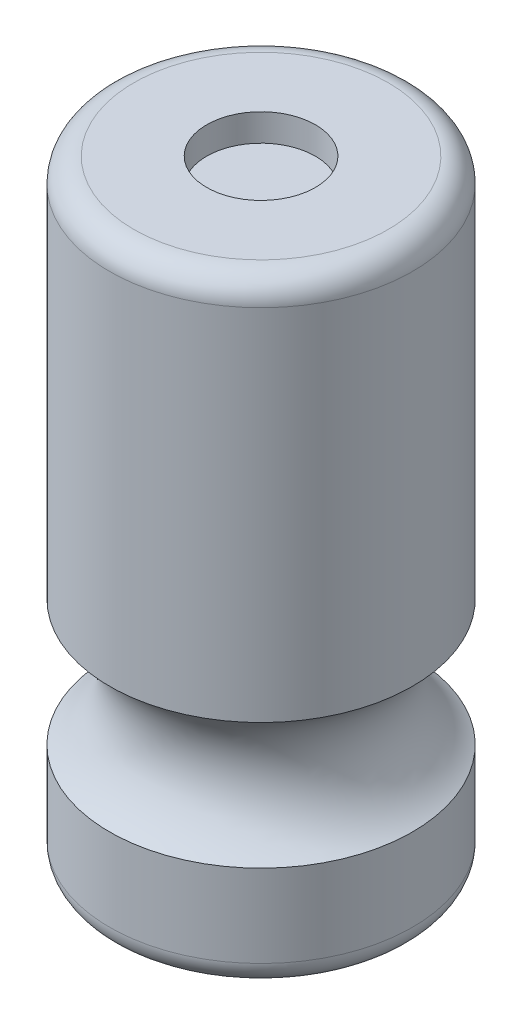
ISO-10303-21;
HEADER;
FILE_DESCRIPTION(('STEP AP214'),'2;1');
FILE_NAME('part.step','',(''),(''),'','','');
FILE_SCHEMA(('AUTOMOTIVE_DESIGN { 1 0 10303 214 1 1 1 1 }'));
ENDSEC;
DATA;
#1=APPLICATION_CONTEXT('core data for automotive mechanical design processes');
#2=APPLICATION_PROTOCOL_DEFINITION('international standard','automotive_design',2000,#1);
#3=PRODUCT_CONTEXT('',#1,'mechanical');
#4=PRODUCT('Part','Part','',(#3));
#5=PRODUCT_RELATED_PRODUCT_CATEGORY('part','',(#4));
#6=PRODUCT_DEFINITION_FORMATION('','',#4);
#7=PRODUCT_DEFINITION_CONTEXT('part definition',#1,'design');
#8=PRODUCT_DEFINITION('design','',#6,#7);
#9=PRODUCT_DEFINITION_SHAPE('','',#8);
#10=(LENGTH_UNIT() NAMED_UNIT(*) SI_UNIT(.MILLI.,.METRE.));
#11=(NAMED_UNIT(*) PLANE_ANGLE_UNIT() SI_UNIT($,.RADIAN.));
#12=(NAMED_UNIT(*) SI_UNIT($,.STERADIAN.) SOLID_ANGLE_UNIT());
#13=UNCERTAINTY_MEASURE_WITH_UNIT(LENGTH_MEASURE(1.E-05),#10,'distance_accuracy_value','');
#14=(GEOMETRIC_REPRESENTATION_CONTEXT(3) GLOBAL_UNCERTAINTY_ASSIGNED_CONTEXT((#13)) GLOBAL_UNIT_ASSIGNED_CONTEXT((#10,
#11,#12)) REPRESENTATION_CONTEXT('',''));
#15=CARTESIAN_POINT('',(0.,0.,0.));
#16=DIRECTION('',(0.,0.,1.));
#17=DIRECTION('',(1.,0.,0.));
#18=AXIS2_PLACEMENT_3D('',#15,#16,#17);
#19=CARTESIAN_POINT('',(0.,20.0032813266391,0.));
#20=DIRECTION('',(0.,-1.,0.));
#21=DIRECTION('',(0.,0.,-1.));
#22=AXIS2_PLACEMENT_3D('',#19,#20,#21);
#23=CYLINDRICAL_SURFACE('',#22,1.11995129282039);
#24=CARTESIAN_POINT('',(0.,12.2,0.));
#25=DIRECTION('',(0.,-1.,0.));
#26=DIRECTION('',(0.,0.,-1.));
#27=AXIS2_PLACEMENT_3D('',#24,#25,#26);
#28=CIRCLE('',#27,1.11995129282039);
#29=CARTESIAN_POINT('',(0.,12.2,-1.11995129282039));
#30=VERTEX_POINT('',#29);
#31=EDGE_CURVE('E10',#30,#30,#28,.T.);
#32=ORIENTED_EDGE('',*,*,#31,.T.);
#33=EDGE_LOOP('',(#32));
#34=FACE_BOUND('',#33,.T.);
#35=CARTESIAN_POINT('',(0.,12.761488904877,0.));
#36=DIRECTION('',(0.,-1.,0.));
#37=DIRECTION('',(0.,0.,-1.));
#38=AXIS2_PLACEMENT_3D('',#35,#36,#37);
#39=CIRCLE('',#38,1.11995129282039);
#40=CARTESIAN_POINT('',(0.,12.761488904877,-1.11995129282039));
#41=VERTEX_POINT('',#40);
#42=EDGE_CURVE('E65',#41,#41,#39,.T.);
#43=ORIENTED_EDGE('',*,*,#42,.F.);
#44=EDGE_LOOP('',(#43));
#45=FACE_BOUND('',#44,.T.);
#46=ADVANCED_FACE('F31',(#34,#45),#23,.F.);
#47=CARTESIAN_POINT('',(1.11995129282039,12.2,0.));
#48=DIRECTION('',(0.,1.,0.));
#49=DIRECTION('',(0.,0.,1.));
#50=AXIS2_PLACEMENT_3D('',#47,#48,#49);
#51=PLANE('',#50);
#52=ORIENTED_EDGE('',*,*,#31,.F.);
#53=EDGE_LOOP('',(#52));
#54=FACE_BOUND('',#53,.T.);
#55=ADVANCED_FACE('F73',(#54),#51,.T.);
#56=CARTESIAN_POINT('',(0.,1.,0.));
#57=DIRECTION('',(0.,-1.,0.));
#58=DIRECTION('',(0.,0.,-1.));
#59=AXIS2_PLACEMENT_3D('',#56,#57,#58);
#60=PLANE('',#59);
#61=CARTESIAN_POINT('',(0.,1.,0.));
#62=DIRECTION('',(0.,-1.,0.));
#63=DIRECTION('',(0.,0.,-1.));
#64=AXIS2_PLACEMENT_3D('',#61,#62,#63);
#65=CIRCLE('',#64,1.11995129282039);
#66=CARTESIAN_POINT('',(0.,1.,-1.11995129282039));
#67=VERTEX_POINT('',#66);
#68=EDGE_CURVE('E37',#67,#67,#65,.T.);
#69=ORIENTED_EDGE('',*,*,#68,.T.);
#70=EDGE_LOOP('',(#69));
#71=FACE_BOUND('',#70,.T.);
#72=ADVANCED_FACE('F77',(#71),#60,.T.);
#73=CARTESIAN_POINT('',(0.,20.0032813266391,0.));
#74=DIRECTION('',(0.,-1.,0.));
#75=DIRECTION('',(0.,0.,-1.));
#76=AXIS2_PLACEMENT_3D('',#73,#74,#75);
#77=CYLINDRICAL_SURFACE('',#76,1.11995129282039);
#78=CARTESIAN_POINT('',(0.,0.0614889092003246,0.));
#79=DIRECTION('',(0.,-1.,0.));
#80=DIRECTION('',(0.,0.,-1.));
#81=AXIS2_PLACEMENT_3D('',#78,#79,#80);
#82=CIRCLE('',#81,1.11995129282039);
#83=CARTESIAN_POINT('',(0.,0.0614889092003246,-1.11995129282039));
#84=VERTEX_POINT('',#83);
#85=EDGE_CURVE('E41',#84,#84,#82,.T.);
#86=ORIENTED_EDGE('',*,*,#85,.T.);
#87=EDGE_LOOP('',(#86));
#88=FACE_BOUND('',#87,.T.);
#89=ORIENTED_EDGE('',*,*,#68,.F.);
#90=EDGE_LOOP('',(#89));
#91=FACE_BOUND('',#90,.T.);
#92=ADVANCED_FACE('F82',(#88,#91),#77,.F.);
#93=CARTESIAN_POINT('',(1.11995129282039,0.061488909200325,0.));
#94=DIRECTION('',(0.,-1.,0.));
#95=DIRECTION('',(0.,0.,-1.));
#96=AXIS2_PLACEMENT_3D('',#93,#94,#95);
#97=PLANE('',#96);
#98=CARTESIAN_POINT('',(0.,0.0614889092003246,0.));
#99=DIRECTION('',(0.,-1.,0.));
#100=DIRECTION('',(0.,0.,-1.));
#101=AXIS2_PLACEMENT_3D('',#98,#99,#100);
#102=CIRCLE('',#101,2.61995129282039);
#103=CARTESIAN_POINT('',(0.,0.0614889092003246,-2.61995129282039));
#104=VERTEX_POINT('',#103);
#105=EDGE_CURVE('E45',#104,#104,#102,.T.);
#106=ORIENTED_EDGE('',*,*,#105,.T.);
#107=EDGE_LOOP('',(#106));
#108=FACE_BOUND('',#107,.T.);
#109=ORIENTED_EDGE('',*,*,#85,.F.);
#110=EDGE_LOOP('',(#109));
#111=FACE_BOUND('',#110,.T.);
#112=ADVANCED_FACE('F87',(#108,#111),#97,.T.);
#113=CARTESIAN_POINT('',(0.,0.561488909200325,0.));
#114=DIRECTION('',(0.,-1.,0.));
#115=DIRECTION('',(0.,0.,-1.));
#116=AXIS2_PLACEMENT_3D('',#113,#114,#115);
#117=TOROIDAL_SURFACE('',#116,2.61995129282039,0.5);
#118=CARTESIAN_POINT('',(0.,0.561488909200325,0.));
#119=DIRECTION('',(0.,-1.,0.));
#120=DIRECTION('',(0.,0.,-1.));
#121=AXIS2_PLACEMENT_3D('',#118,#119,#120);
#122=CIRCLE('',#121,3.11995129282039);
#123=CARTESIAN_POINT('',(0.,0.561488909200325,-3.11995129282039));
#124=VERTEX_POINT('',#123);
#125=EDGE_CURVE('E50',#124,#124,#122,.T.);
#126=ORIENTED_EDGE('',*,*,#125,.T.);
#127=EDGE_LOOP('',(#126));
#128=FACE_BOUND('',#127,.T.);
#129=ORIENTED_EDGE('',*,*,#105,.F.);
#130=EDGE_LOOP('',(#129));
#131=FACE_BOUND('',#130,.T.);
#132=ADVANCED_FACE('F91',(#128,#131),#117,.T.);
#133=CARTESIAN_POINT('',(0.,20.0032813266391,0.));
#134=DIRECTION('',(0.,-1.,0.));
#135=DIRECTION('',(0.,0.,-1.));
#136=AXIS2_PLACEMENT_3D('',#133,#134,#135);
#137=CYLINDRICAL_SURFACE('',#136,3.11995129282039);
#138=CARTESIAN_POINT('',(0.,2.26245080352367,0.));
#139=DIRECTION('',(0.,-1.,0.));
#140=DIRECTION('',(0.,0.,-1.));
#141=AXIS2_PLACEMENT_3D('',#138,#139,#140);
#142=CIRCLE('',#141,3.11995129282039);
#143=CARTESIAN_POINT('',(0.,2.26245080352367,-3.11995129282039));
#144=VERTEX_POINT('',#143);
#145=EDGE_CURVE('E53',#144,#144,#142,.T.);
#146=ORIENTED_EDGE('',*,*,#145,.T.);
#147=EDGE_LOOP('',(#146));
#148=FACE_BOUND('',#147,.T.);
#149=ORIENTED_EDGE('',*,*,#125,.F.);
#150=EDGE_LOOP('',(#149));
#151=FACE_BOUND('',#150,.T.);
#152=ADVANCED_FACE('F95',(#148,#151),#137,.T.);
#153=CARTESIAN_POINT('',(0.,3.56148890920032,0.));
#154=DIRECTION('',(0.,-1.,0.));
#155=DIRECTION('',(0.,0.,-1.));
#156=AXIS2_PLACEMENT_3D('',#153,#154,#155);
#157=TOROIDAL_SURFACE('',#156,3.86995129282039,1.5);
#158=CARTESIAN_POINT('',(0.,4.86052701487699,0.));
#159=DIRECTION('',(0.,-1.,0.));
#160=DIRECTION('',(0.,0.,-1.));
#161=AXIS2_PLACEMENT_3D('',#158,#159,#160);
#162=CIRCLE('',#161,3.11995129282039);
#163=CARTESIAN_POINT('',(0.,4.86052701487699,-3.11995129282039));
#164=VERTEX_POINT('',#163);
#165=EDGE_CURVE('E56',#164,#164,#162,.T.);
#166=ORIENTED_EDGE('',*,*,#165,.T.);
#167=EDGE_LOOP('',(#166));
#168=FACE_BOUND('',#167,.T.);
#169=ORIENTED_EDGE('',*,*,#145,.F.);
#170=EDGE_LOOP('',(#169));
#171=FACE_BOUND('',#170,.T.);
#172=ADVANCED_FACE('F99',(#168,#171),#157,.F.);
#173=CARTESIAN_POINT('',(0.,20.0032813266391,0.));
#174=DIRECTION('',(0.,-1.,0.));
#175=DIRECTION('',(0.,0.,-1.));
#176=AXIS2_PLACEMENT_3D('',#173,#174,#175);
#177=CYLINDRICAL_SURFACE('',#176,3.11995129282039);
#178=CARTESIAN_POINT('',(0.,12.261488904877,0.));
#179=DIRECTION('',(0.,-1.,0.));
#180=DIRECTION('',(0.,0.,-1.));
#181=AXIS2_PLACEMENT_3D('',#178,#179,#180);
#182=CIRCLE('',#181,3.11995129282039);
#183=CARTESIAN_POINT('',(0.,12.261488904877,-3.11995129282039));
#184=VERTEX_POINT('',#183);
#185=EDGE_CURVE('E59',#184,#184,#182,.T.);
#186=ORIENTED_EDGE('',*,*,#185,.T.);
#187=EDGE_LOOP('',(#186));
#188=FACE_BOUND('',#187,.T.);
#189=ORIENTED_EDGE('',*,*,#165,.F.);
#190=EDGE_LOOP('',(#189));
#191=FACE_BOUND('',#190,.T.);
#192=ADVANCED_FACE('F103',(#188,#191),#177,.T.);
#193=CARTESIAN_POINT('',(0.,12.261488904877,0.));
#194=DIRECTION('',(0.,-1.,0.));
#195=DIRECTION('',(0.,0.,-1.));
#196=AXIS2_PLACEMENT_3D('',#193,#194,#195);
#197=TOROIDAL_SURFACE('',#196,2.61995129282039,0.5);
#198=CARTESIAN_POINT('',(0.,12.761488904877,0.));
#199=DIRECTION('',(0.,-1.,0.));
#200=DIRECTION('',(0.,0.,-1.));
#201=AXIS2_PLACEMENT_3D('',#198,#199,#200);
#202=CIRCLE('',#201,2.61995129282039);
#203=CARTESIAN_POINT('',(0.,12.761488904877,-2.61995129282039));
#204=VERTEX_POINT('',#203);
#205=EDGE_CURVE('E62',#204,#204,#202,.T.);
#206=ORIENTED_EDGE('',*,*,#205,.T.);
#207=EDGE_LOOP('',(#206));
#208=FACE_BOUND('',#207,.T.);
#209=ORIENTED_EDGE('',*,*,#185,.F.);
#210=EDGE_LOOP('',(#209));
#211=FACE_BOUND('',#210,.T.);
#212=ADVANCED_FACE('F107',(#208,#211),#197,.T.);
#213=CARTESIAN_POINT('',(2.61995129282039,12.761488904877,0.));
#214=DIRECTION('',(0.,1.,0.));
#215=DIRECTION('',(0.,0.,1.));
#216=AXIS2_PLACEMENT_3D('',#213,#214,#215);
#217=PLANE('',#216);
#218=ORIENTED_EDGE('',*,*,#42,.T.);
#219=EDGE_LOOP('',(#218));
#220=FACE_BOUND('',#219,.T.);
#221=ORIENTED_EDGE('',*,*,#205,.F.);
#222=EDGE_LOOP('',(#221));
#223=FACE_BOUND('',#222,.T.);
#224=ADVANCED_FACE('F69',(#220,#223),#217,.T.);
#225=CLOSED_SHELL('',(#46,#55,#72,#92,#112,#132,#152,#172,#192,#212,#224));
#226=MANIFOLD_SOLID_BREP('B2',#225);
#227=ADVANCED_BREP_SHAPE_REPRESENTATION('',(#18,#226),#14);
#228=SHAPE_DEFINITION_REPRESENTATION(#9,#227);
ENDSEC;
END-ISO-10303-21;
